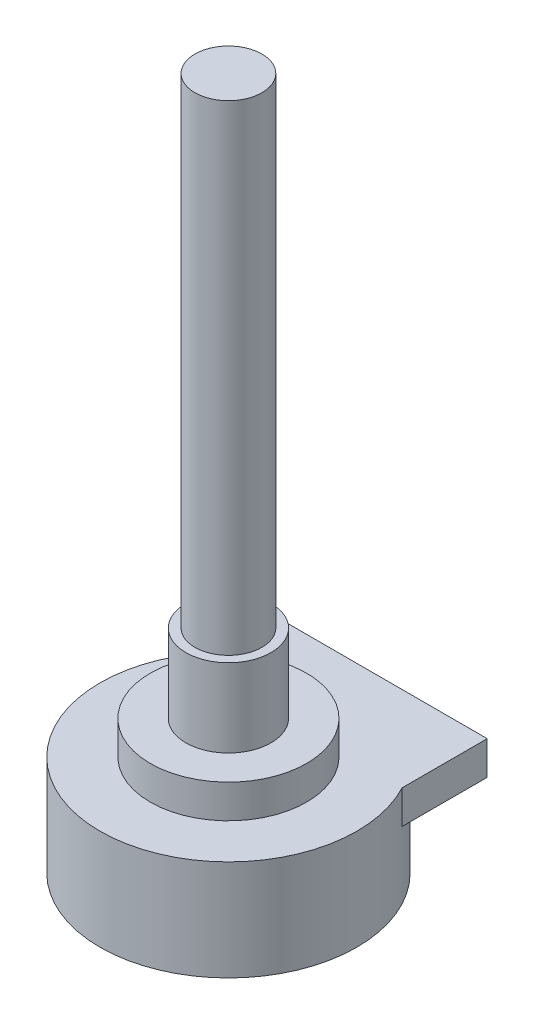
ISO-10303-21;
HEADER;
FILE_DESCRIPTION(('STEP AP214'),'2;1');
FILE_NAME('part.step','',(''),(''),'','','');
FILE_SCHEMA(('AUTOMOTIVE_DESIGN { 1 0 10303 214 1 1 1 1 }'));
ENDSEC;
DATA;
#1=APPLICATION_CONTEXT('core data for automotive mechanical design processes');
#2=APPLICATION_PROTOCOL_DEFINITION('international standard','automotive_design',2000,#1);
#3=PRODUCT_CONTEXT('',#1,'mechanical');
#4=PRODUCT('Part','Part','',(#3));
#5=PRODUCT_RELATED_PRODUCT_CATEGORY('part','',(#4));
#6=PRODUCT_DEFINITION_FORMATION('','',#4);
#7=PRODUCT_DEFINITION_CONTEXT('part definition',#1,'design');
#8=PRODUCT_DEFINITION('design','',#6,#7);
#9=PRODUCT_DEFINITION_SHAPE('','',#8);
#10=(LENGTH_UNIT() NAMED_UNIT(*) SI_UNIT(.MILLI.,.METRE.));
#11=(NAMED_UNIT(*) PLANE_ANGLE_UNIT() SI_UNIT($,.RADIAN.));
#12=(NAMED_UNIT(*) SI_UNIT($,.STERADIAN.) SOLID_ANGLE_UNIT());
#13=UNCERTAINTY_MEASURE_WITH_UNIT(LENGTH_MEASURE(1.E-05),#10,'distance_accuracy_value','');
#14=(GEOMETRIC_REPRESENTATION_CONTEXT(3) GLOBAL_UNCERTAINTY_ASSIGNED_CONTEXT((#13)) GLOBAL_UNIT_ASSIGNED_CONTEXT((#10,
#11,#12)) REPRESENTATION_CONTEXT('',''));
#15=CARTESIAN_POINT('',(0.,0.,0.));
#16=DIRECTION('',(0.,0.,1.));
#17=DIRECTION('',(1.,0.,0.));
#18=AXIS2_PLACEMENT_3D('',#15,#16,#17);
#19=CARTESIAN_POINT('',(11.2776,9.,0.));
#20=DIRECTION('',(1.,0.,0.));
#21=DIRECTION('',(0.,0.,-1.));
#22=AXIS2_PLACEMENT_3D('',#19,#20,#21);
#23=PLANE('',#22);
#24=DIRECTION('',(0.,-1.,0.));
#25=VECTOR('',#24,1.);
#26=CARTESIAN_POINT('',(11.2776,9.,-1.1684));
#27=LINE('',#26,#25);
#28=CARTESIAN_POINT('',(11.2776,9.,-1.1684));
#29=VERTEX_POINT('',#28);
#30=CARTESIAN_POINT('',(11.2776,6.,-1.1684));
#31=VERTEX_POINT('',#30);
#32=EDGE_CURVE('E89',#29,#31,#27,.T.);
#33=ORIENTED_EDGE('',*,*,#32,.T.);
#34=DIRECTION('',(0.,0.,1.));
#35=VECTOR('',#34,1.);
#36=CARTESIAN_POINT('',(11.2776,6.,-8.7884));
#37=LINE('',#36,#35);
#38=CARTESIAN_POINT('',(11.2776,6.,-8.7884));
#39=VERTEX_POINT('',#38);
#40=EDGE_CURVE('E77',#39,#31,#37,.T.);
#41=ORIENTED_EDGE('',*,*,#40,.F.);
#42=DIRECTION('',(0.,-1.,0.));
#43=VECTOR('',#42,1.);
#44=CARTESIAN_POINT('',(11.2776,9.,-8.7884));
#45=LINE('',#44,#43);
#46=CARTESIAN_POINT('',(11.2776,9.,-8.7884));
#47=VERTEX_POINT('',#46);
#48=EDGE_CURVE('E11',#47,#39,#45,.T.);
#49=ORIENTED_EDGE('',*,*,#48,.F.);
#50=DIRECTION('',(0.,0.,1.));
#51=VECTOR('',#50,1.);
#52=CARTESIAN_POINT('',(11.2776,9.,0.));
#53=LINE('',#52,#51);
#54=EDGE_CURVE('E104',#47,#29,#53,.T.);
#55=ORIENTED_EDGE('',*,*,#54,.T.);
#56=EDGE_LOOP('',(#33,#41,#49,#55));
#57=FACE_BOUND('',#56,.T.);
#58=ADVANCED_FACE('F33',(#57),#23,.T.);
#59=CARTESIAN_POINT('',(0.,9.,-8.7884));
#60=DIRECTION('',(0.,0.,-1.));
#61=DIRECTION('',(-1.,0.,0.));
#62=AXIS2_PLACEMENT_3D('',#59,#60,#61);
#63=PLANE('',#62);
#64=ORIENTED_EDGE('',*,*,#48,.T.);
#65=DIRECTION('',(1.,0.,0.));
#66=VECTOR('',#65,1.);
#67=CARTESIAN_POINT('',(-9.0424,6.,-8.7884));
#68=LINE('',#67,#66);
#69=CARTESIAN_POINT('',(-9.0424,6.,-8.7884));
#70=VERTEX_POINT('',#69);
#71=EDGE_CURVE('E86',#70,#39,#68,.T.);
#72=ORIENTED_EDGE('',*,*,#71,.F.);
#73=DIRECTION('',(0.,-1.,0.));
#74=VECTOR('',#73,1.);
#75=CARTESIAN_POINT('',(-9.0424,9.,-8.7884));
#76=LINE('',#75,#74);
#77=CARTESIAN_POINT('',(-9.0424,9.,-8.7884));
#78=VERTEX_POINT('',#77);
#79=EDGE_CURVE('E40',#78,#70,#76,.T.);
#80=ORIENTED_EDGE('',*,*,#79,.F.);
#81=DIRECTION('',(1.,0.,0.));
#82=VECTOR('',#81,1.);
#83=CARTESIAN_POINT('',(0.,9.,-8.7884));
#84=LINE('',#83,#82);
#85=EDGE_CURVE('E101',#78,#47,#84,.T.);
#86=ORIENTED_EDGE('',*,*,#85,.T.);
#87=EDGE_LOOP('',(#64,#72,#80,#86));
#88=FACE_BOUND('',#87,.T.);
#89=ADVANCED_FACE('F126',(#88),#63,.T.);
#90=CARTESIAN_POINT('',(-9.0424,9.,0.));
#91=DIRECTION('',(1.,0.,0.));
#92=DIRECTION('',(0.,0.,-1.));
#93=AXIS2_PLACEMENT_3D('',#90,#91,#92);
#94=PLANE('',#93);
#95=DIRECTION('',(0.,0.,-1.));
#96=VECTOR('',#95,1.);
#97=CARTESIAN_POINT('',(-9.0424,6.,-1.1684));
#98=LINE('',#97,#96);
#99=CARTESIAN_POINT('',(-9.0424,6.,-1.1684));
#100=VERTEX_POINT('',#99);
#101=EDGE_CURVE('E74',#100,#70,#98,.T.);
#102=ORIENTED_EDGE('',*,*,#101,.F.);
#103=DIRECTION('',(0.,-1.,0.));
#104=VECTOR('',#103,1.);
#105=CARTESIAN_POINT('',(-9.0424,9.,-1.1684));
#106=LINE('',#105,#104);
#107=CARTESIAN_POINT('',(-9.0424,9.,-1.1684));
#108=VERTEX_POINT('',#107);
#109=EDGE_CURVE('E85',#108,#100,#106,.T.);
#110=ORIENTED_EDGE('',*,*,#109,.F.);
#111=DIRECTION('',(0.,0.,1.));
#112=VECTOR('',#111,1.);
#113=CARTESIAN_POINT('',(-9.0424,9.,0.));
#114=LINE('',#113,#112);
#115=EDGE_CURVE('E99',#78,#108,#114,.T.);
#116=ORIENTED_EDGE('',*,*,#115,.F.);
#117=ORIENTED_EDGE('',*,*,#79,.T.);
#118=EDGE_LOOP('',(#102,#110,#116,#117));
#119=FACE_BOUND('',#118,.T.);
#120=ADVANCED_FACE('F83',(#119),#94,.F.);
#121=CARTESIAN_POINT('',(1.1176,9.,4.21902981392797));
#122=DIRECTION('',(0.,-1.,0.));
#123=DIRECTION('',(0.,0.,-1.));
#124=AXIS2_PLACEMENT_3D('',#121,#122,#123);
#125=CYLINDRICAL_SURFACE('',#124,11.5);
#126=CARTESIAN_POINT('',(1.1176,0.,4.21902981392797));
#127=DIRECTION('',(0.,1.,0.));
#128=DIRECTION('',(0.,0.,1.));
#129=AXIS2_PLACEMENT_3D('',#126,#127,#128);
#130=CIRCLE('',#129,11.5);
#131=CARTESIAN_POINT('',(1.1176,0.,15.719029813928));
#132=VERTEX_POINT('',#131);
#133=EDGE_CURVE('E93',#132,#132,#130,.T.);
#134=ORIENTED_EDGE('',*,*,#133,.T.);
#135=EDGE_LOOP('',(#134));
#136=FACE_BOUND('',#135,.T.);
#137=CARTESIAN_POINT('',(1.1176,6.,4.21902981392801));
#138=DIRECTION('',(0.,1.,0.));
#139=DIRECTION('',(0.,0.,-1.));
#140=AXIS2_PLACEMENT_3D('',#137,#138,#139);
#141=CIRCLE('',#140,11.5);
#142=EDGE_CURVE('E71',#31,#100,#141,.T.);
#143=ORIENTED_EDGE('',*,*,#142,.F.);
#144=ORIENTED_EDGE('',*,*,#32,.F.);
#145=CARTESIAN_POINT('',(1.1176,9.,4.21902981392797));
#146=DIRECTION('',(0.,1.,0.));
#147=DIRECTION('',(0.,0.,1.));
#148=AXIS2_PLACEMENT_3D('',#145,#146,#147);
#149=CIRCLE('',#148,11.5);
#150=EDGE_CURVE('E47',#108,#29,#149,.T.);
#151=ORIENTED_EDGE('',*,*,#150,.F.);
#152=ORIENTED_EDGE('',*,*,#109,.T.);
#153=EDGE_LOOP('',(#143,#144,#151,#152));
#154=FACE_BOUND('',#153,.T.);
#155=ADVANCED_FACE('F88',(#136,#154),#125,.T.);
#156=CARTESIAN_POINT('',(0.,9.,0.));
#157=DIRECTION('',(0.,1.,0.));
#158=DIRECTION('',(0.,0.,1.));
#159=AXIS2_PLACEMENT_3D('',#156,#157,#158);
#160=PLANE('',#159);
#161=CARTESIAN_POINT('',(1.1176,9.,4.21902981392797));
#162=DIRECTION('',(0.,1.,0.));
#163=DIRECTION('',(0.,0.,1.));
#164=AXIS2_PLACEMENT_3D('',#161,#162,#163);
#165=CIRCLE('',#164,7.);
#166=CARTESIAN_POINT('',(1.1176,9.,11.219029813928));
#167=VERTEX_POINT('',#166);
#168=EDGE_CURVE('E96',#167,#167,#165,.T.);
#169=ORIENTED_EDGE('',*,*,#168,.F.);
#170=EDGE_LOOP('',(#169));
#171=FACE_BOUND('',#170,.T.);
#172=ORIENTED_EDGE('',*,*,#54,.F.);
#173=ORIENTED_EDGE('',*,*,#85,.F.);
#174=ORIENTED_EDGE('',*,*,#115,.T.);
#175=ORIENTED_EDGE('',*,*,#150,.T.);
#176=EDGE_LOOP('',(#172,#173,#174,#175));
#177=FACE_BOUND('',#176,.T.);
#178=ADVANCED_FACE('F128',(#171,#177),#160,.T.);
#179=CARTESIAN_POINT('',(0.,0.,0.));
#180=DIRECTION('',(0.,1.,0.));
#181=DIRECTION('',(0.,0.,1.));
#182=AXIS2_PLACEMENT_3D('',#179,#180,#181);
#183=PLANE('',#182);
#184=ORIENTED_EDGE('',*,*,#133,.F.);
#185=EDGE_LOOP('',(#184));
#186=FACE_BOUND('',#185,.T.);
#187=ADVANCED_FACE('F130',(#186),#183,.F.);
#188=CARTESIAN_POINT('',(1.1176,12.,4.21902981392797));
#189=DIRECTION('',(0.,-1.,0.));
#190=DIRECTION('',(0.,0.,-1.));
#191=AXIS2_PLACEMENT_3D('',#188,#189,#190);
#192=CYLINDRICAL_SURFACE('',#191,7.);
#193=ORIENTED_EDGE('',*,*,#168,.T.);
#194=EDGE_LOOP('',(#193));
#195=FACE_BOUND('',#194,.T.);
#196=CARTESIAN_POINT('',(1.1176,12.,4.21902981392797));
#197=DIRECTION('',(0.,1.,0.));
#198=DIRECTION('',(0.,0.,1.));
#199=AXIS2_PLACEMENT_3D('',#196,#197,#198);
#200=CIRCLE('',#199,7.);
#201=CARTESIAN_POINT('',(1.1176,12.,11.219029813928));
#202=VERTEX_POINT('',#201);
#203=EDGE_CURVE('E97',#202,#202,#200,.T.);
#204=ORIENTED_EDGE('',*,*,#203,.F.);
#205=EDGE_LOOP('',(#204));
#206=FACE_BOUND('',#205,.T.);
#207=ADVANCED_FACE('F137',(#195,#206),#192,.T.);
#208=CARTESIAN_POINT('',(0.,12.,0.));
#209=DIRECTION('',(0.,1.,0.));
#210=DIRECTION('',(0.,0.,1.));
#211=AXIS2_PLACEMENT_3D('',#208,#209,#210);
#212=PLANE('',#211);
#213=CARTESIAN_POINT('',(1.1176,12.,4.21902981392797));
#214=DIRECTION('',(0.,1.,0.));
#215=DIRECTION('',(0.,0.,1.));
#216=AXIS2_PLACEMENT_3D('',#213,#214,#215);
#217=CIRCLE('',#216,3.81);
#218=CARTESIAN_POINT('',(1.1176,12.,8.02902981392797));
#219=VERTEX_POINT('',#218);
#220=EDGE_CURVE('E111',#219,#219,#217,.T.);
#221=ORIENTED_EDGE('',*,*,#220,.F.);
#222=EDGE_LOOP('',(#221));
#223=FACE_BOUND('',#222,.T.);
#224=ORIENTED_EDGE('',*,*,#203,.T.);
#225=EDGE_LOOP('',(#224));
#226=FACE_BOUND('',#225,.T.);
#227=ADVANCED_FACE('F210',(#223,#226),#212,.T.);
#228=CARTESIAN_POINT('',(1.1176,19.,4.21902981392797));
#229=DIRECTION('',(0.,-1.,0.));
#230=DIRECTION('',(0.,0.,-1.));
#231=AXIS2_PLACEMENT_3D('',#228,#229,#230);
#232=CYLINDRICAL_SURFACE('',#231,3.81);
#233=ORIENTED_EDGE('',*,*,#220,.T.);
#234=EDGE_LOOP('',(#233));
#235=FACE_BOUND('',#234,.T.);
#236=CARTESIAN_POINT('',(1.1176,19.,4.21902981392797));
#237=DIRECTION('',(0.,1.,0.));
#238=DIRECTION('',(0.,0.,1.));
#239=AXIS2_PLACEMENT_3D('',#236,#237,#238);
#240=CIRCLE('',#239,3.81);
#241=CARTESIAN_POINT('',(1.1176,19.,8.02902981392797));
#242=VERTEX_POINT('',#241);
#243=EDGE_CURVE('E114',#242,#242,#240,.T.);
#244=ORIENTED_EDGE('',*,*,#243,.F.);
#245=EDGE_LOOP('',(#244));
#246=FACE_BOUND('',#245,.T.);
#247=ADVANCED_FACE('F202',(#235,#246),#232,.T.);
#248=CARTESIAN_POINT('',(0.,19.,0.));
#249=DIRECTION('',(0.,1.,0.));
#250=DIRECTION('',(0.,0.,1.));
#251=AXIS2_PLACEMENT_3D('',#248,#249,#250);
#252=PLANE('',#251);
#253=CARTESIAN_POINT('',(1.1176,19.,4.21902981392797));
#254=DIRECTION('',(0.,1.,0.));
#255=DIRECTION('',(0.,0.,1.));
#256=AXIS2_PLACEMENT_3D('',#253,#254,#255);
#257=CIRCLE('',#256,3.);
#258=CARTESIAN_POINT('',(1.1176,19.,7.21902981392797));
#259=VERTEX_POINT('',#258);
#260=EDGE_CURVE('E117',#259,#259,#257,.T.);
#261=ORIENTED_EDGE('',*,*,#260,.F.);
#262=EDGE_LOOP('',(#261));
#263=FACE_BOUND('',#262,.T.);
#264=ORIENTED_EDGE('',*,*,#243,.T.);
#265=EDGE_LOOP('',(#264));
#266=FACE_BOUND('',#265,.T.);
#267=ADVANCED_FACE('F194',(#263,#266),#252,.T.);
#268=CARTESIAN_POINT('',(0.,62.,0.));
#269=DIRECTION('',(0.,1.,0.));
#270=DIRECTION('',(0.,0.,1.));
#271=AXIS2_PLACEMENT_3D('',#268,#269,#270);
#272=PLANE('',#271);
#273=CARTESIAN_POINT('',(1.1176,62.,4.21902981392797));
#274=DIRECTION('',(0.,1.,0.));
#275=DIRECTION('',(0.,0.,1.));
#276=AXIS2_PLACEMENT_3D('',#273,#274,#275);
#277=CIRCLE('',#276,3.);
#278=CARTESIAN_POINT('',(1.1176,62.,7.21902981392797));
#279=VERTEX_POINT('',#278);
#280=EDGE_CURVE('E120',#279,#279,#277,.T.);
#281=ORIENTED_EDGE('',*,*,#280,.T.);
#282=EDGE_LOOP('',(#281));
#283=FACE_BOUND('',#282,.T.);
#284=ADVANCED_FACE('F186',(#283),#272,.T.);
#285=CARTESIAN_POINT('',(1.1176,62.,4.21902981392797));
#286=DIRECTION('',(0.,-1.,0.));
#287=DIRECTION('',(0.,0.,-1.));
#288=AXIS2_PLACEMENT_3D('',#285,#286,#287);
#289=CYLINDRICAL_SURFACE('',#288,3.);
#290=ORIENTED_EDGE('',*,*,#260,.T.);
#291=EDGE_LOOP('',(#290));
#292=FACE_BOUND('',#291,.T.);
#293=ORIENTED_EDGE('',*,*,#280,.F.);
#294=EDGE_LOOP('',(#293));
#295=FACE_BOUND('',#294,.T.);
#296=ADVANCED_FACE('F177',(#292,#295),#289,.T.);
#297=CARTESIAN_POINT('',(1.1176,6.,4.21902981392801));
#298=DIRECTION('',(0.,-1.,0.));
#299=DIRECTION('',(0.,0.,-1.));
#300=AXIS2_PLACEMENT_3D('',#297,#298,#299);
#301=PLANE('',#300);
#302=ORIENTED_EDGE('',*,*,#142,.T.);
#303=ORIENTED_EDGE('',*,*,#101,.T.);
#304=ORIENTED_EDGE('',*,*,#71,.T.);
#305=ORIENTED_EDGE('',*,*,#40,.T.);
#306=EDGE_LOOP('',(#302,#303,#304,#305));
#307=FACE_BOUND('',#306,.T.);
#308=ADVANCED_FACE('F73',(#307),#301,.T.);
#309=CLOSED_SHELL('',(#58,#89,#120,#155,#178,#187,#207,#227,#247,#267,#284,#296,#308));
#310=MANIFOLD_SOLID_BREP('B2',#309);
#311=ADVANCED_BREP_SHAPE_REPRESENTATION('',(#18,#310),#14);
#312=SHAPE_DEFINITION_REPRESENTATION(#9,#311);
ENDSEC;
END-ISO-10303-21;
